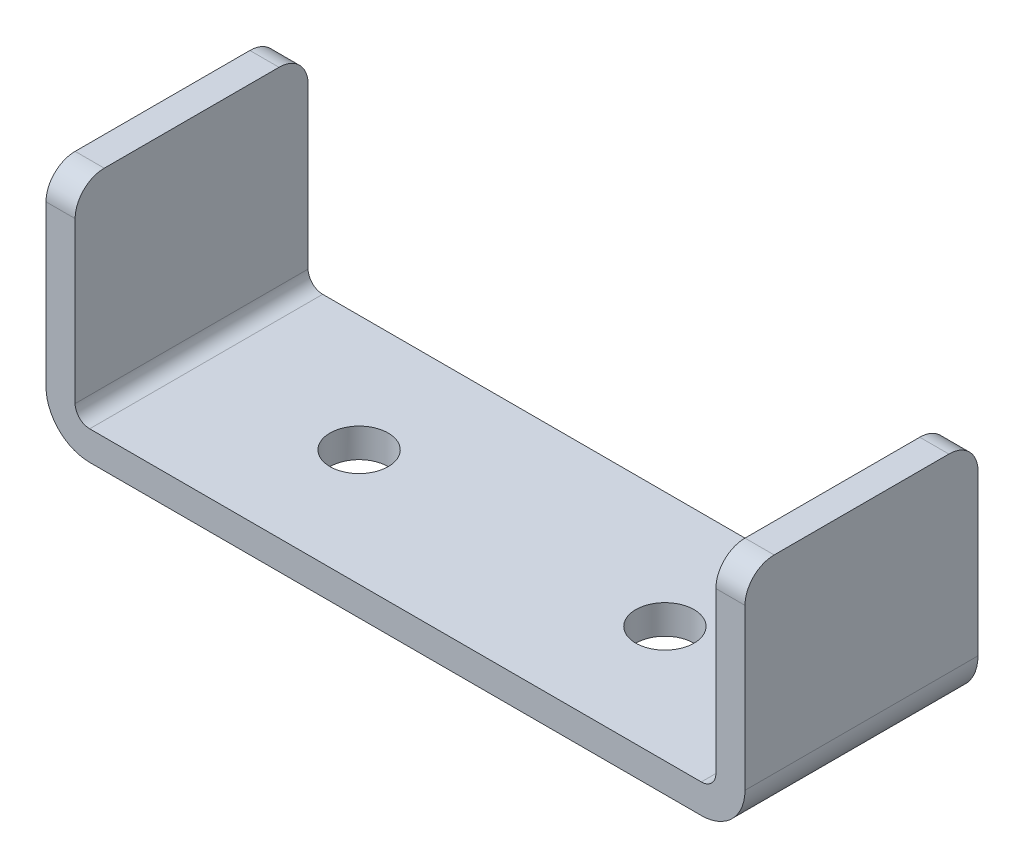
ISO-10303-21;
HEADER;
FILE_DESCRIPTION(('STEP AP214'),'2;1');
FILE_NAME('part.step','',(''),(''),'','','');
FILE_SCHEMA(('AUTOMOTIVE_DESIGN { 1 0 10303 214 1 1 1 1 }'));
ENDSEC;
DATA;
#1=APPLICATION_CONTEXT('core data for automotive mechanical design processes');
#2=APPLICATION_PROTOCOL_DEFINITION('international standard','automotive_design',2000,#1);
#3=PRODUCT_CONTEXT('',#1,'mechanical');
#4=PRODUCT('Part','Part','',(#3));
#5=PRODUCT_RELATED_PRODUCT_CATEGORY('part','',(#4));
#6=PRODUCT_DEFINITION_FORMATION('','',#4);
#7=PRODUCT_DEFINITION_CONTEXT('part definition',#1,'design');
#8=PRODUCT_DEFINITION('design','',#6,#7);
#9=PRODUCT_DEFINITION_SHAPE('','',#8);
#10=(LENGTH_UNIT() NAMED_UNIT(*) SI_UNIT(.MILLI.,.METRE.));
#11=(NAMED_UNIT(*) PLANE_ANGLE_UNIT() SI_UNIT($,.RADIAN.));
#12=(NAMED_UNIT(*) SI_UNIT($,.STERADIAN.) SOLID_ANGLE_UNIT());
#13=UNCERTAINTY_MEASURE_WITH_UNIT(LENGTH_MEASURE(1.E-05),#10,'distance_accuracy_value','');
#14=(GEOMETRIC_REPRESENTATION_CONTEXT(3) GLOBAL_UNCERTAINTY_ASSIGNED_CONTEXT((#13)) GLOBAL_UNIT_ASSIGNED_CONTEXT((#10,
#11,#12)) REPRESENTATION_CONTEXT('',''));
#15=CARTESIAN_POINT('',(0.,0.,0.));
#16=DIRECTION('',(0.,0.,1.));
#17=DIRECTION('',(1.,0.,0.));
#18=AXIS2_PLACEMENT_3D('',#15,#16,#17);
#19=CARTESIAN_POINT('',(76.2,4.7625,-25.4));
#20=DIRECTION('',(1.,0.,0.));
#21=DIRECTION('',(0.,1.,0.));
#22=AXIS2_PLACEMENT_3D('',#19,#20,#21);
#23=PLANE('',#22);
#24=DIRECTION('',(0.,0.,1.));
#25=VECTOR('',#24,1.);
#26=CARTESIAN_POINT('',(76.2,25.4,-25.4));
#27=LINE('',#26,#25);
#28=CARTESIAN_POINT('',(76.2,25.4,-22.225));
#29=VERTEX_POINT('',#28);
#30=CARTESIAN_POINT('',(76.2,25.4,-3.175));
#31=VERTEX_POINT('',#30);
#32=EDGE_CURVE('E195',#29,#31,#27,.T.);
#33=ORIENTED_EDGE('',*,*,#32,.T.);
#34=CARTESIAN_POINT('',(76.2,22.225,-3.175));
#35=DIRECTION('',(1.,0.,0.));
#36=DIRECTION('',(0.,1.,0.));
#37=AXIS2_PLACEMENT_3D('',#34,#35,#36);
#38=CIRCLE('',#37,3.175);
#39=CARTESIAN_POINT('',(76.2,22.225,0.));
#40=VERTEX_POINT('',#39);
#41=EDGE_CURVE('E251',#31,#40,#38,.T.);
#42=ORIENTED_EDGE('',*,*,#41,.T.);
#43=DIRECTION('',(0.,1.,0.));
#44=VECTOR('',#43,1.);
#45=CARTESIAN_POINT('',(76.2,4.7625,0.));
#46=LINE('',#45,#44);
#47=CARTESIAN_POINT('',(76.2,4.7625,0.));
#48=VERTEX_POINT('',#47);
#49=EDGE_CURVE('E196',#48,#40,#46,.T.);
#50=ORIENTED_EDGE('',*,*,#49,.F.);
#51=DIRECTION('',(0.,0.,1.));
#52=VECTOR('',#51,1.);
#53=CARTESIAN_POINT('',(76.2,4.7625,-25.4));
#54=LINE('',#53,#52);
#55=CARTESIAN_POINT('',(76.2,4.7625,-25.4));
#56=VERTEX_POINT('',#55);
#57=EDGE_CURVE('E219',#56,#48,#54,.T.);
#58=ORIENTED_EDGE('',*,*,#57,.F.);
#59=DIRECTION('',(0.,1.,0.));
#60=VECTOR('',#59,1.);
#61=CARTESIAN_POINT('',(76.2,4.7625,-25.4));
#62=LINE('',#61,#60);
#63=CARTESIAN_POINT('',(76.2,22.225,-25.4));
#64=VERTEX_POINT('',#63);
#65=EDGE_CURVE('E172',#56,#64,#62,.T.);
#66=ORIENTED_EDGE('',*,*,#65,.T.);
#67=CARTESIAN_POINT('',(76.2,22.225,-22.225));
#68=DIRECTION('',(1.,0.,0.));
#69=DIRECTION('',(0.,1.,0.));
#70=AXIS2_PLACEMENT_3D('',#67,#68,#69);
#71=CIRCLE('',#70,3.175);
#72=EDGE_CURVE('E249',#64,#29,#71,.T.);
#73=ORIENTED_EDGE('',*,*,#72,.T.);
#74=EDGE_LOOP('',(#33,#42,#50,#58,#66,#73));
#75=FACE_BOUND('',#74,.T.);
#76=ADVANCED_FACE('F31',(#75),#23,.T.);
#77=CARTESIAN_POINT('',(71.4375,4.7625,-25.4));
#78=DIRECTION('',(0.,0.,1.));
#79=DIRECTION('',(1.,0.,0.));
#80=AXIS2_PLACEMENT_3D('',#77,#78,#79);
#81=CYLINDRICAL_SURFACE('',#80,4.76250000000001);
#82=CARTESIAN_POINT('',(71.4375,4.7625,0.));
#83=DIRECTION('',(0.,0.,1.));
#84=DIRECTION('',(1.,0.,0.));
#85=AXIS2_PLACEMENT_3D('',#82,#83,#84);
#86=CIRCLE('',#85,4.76250000000001);
#87=CARTESIAN_POINT('',(71.4375,0.,0.));
#88=VERTEX_POINT('',#87);
#89=EDGE_CURVE('E175',#88,#48,#86,.T.);
#90=ORIENTED_EDGE('',*,*,#89,.F.);
#91=DIRECTION('',(0.,0.,1.));
#92=VECTOR('',#91,1.);
#93=CARTESIAN_POINT('',(71.4375,0.,-25.4));
#94=LINE('',#93,#92);
#95=CARTESIAN_POINT('',(71.4375,0.,-25.4));
#96=VERTEX_POINT('',#95);
#97=EDGE_CURVE('E222',#96,#88,#94,.T.);
#98=ORIENTED_EDGE('',*,*,#97,.F.);
#99=CARTESIAN_POINT('',(71.4375,4.7625,-25.4));
#100=DIRECTION('',(0.,0.,1.));
#101=DIRECTION('',(1.,0.,0.));
#102=AXIS2_PLACEMENT_3D('',#99,#100,#101);
#103=CIRCLE('',#102,4.76250000000001);
#104=EDGE_CURVE('E192',#96,#56,#103,.T.);
#105=ORIENTED_EDGE('',*,*,#104,.T.);
#106=ORIENTED_EDGE('',*,*,#57,.T.);
#107=EDGE_LOOP('',(#90,#98,#105,#106));
#108=FACE_BOUND('',#107,.T.);
#109=ADVANCED_FACE('F308',(#108),#81,.T.);
#110=CARTESIAN_POINT('',(4.7625,0.,-25.4));
#111=DIRECTION('',(0.,-1.,0.));
#112=DIRECTION('',(0.,0.,-1.));
#113=AXIS2_PLACEMENT_3D('',#110,#111,#112);
#114=PLANE('',#113);
#115=CARTESIAN_POINT('',(54.76875,0.,-12.7));
#116=DIRECTION('',(0.,-1.,0.));
#117=DIRECTION('',(0.,0.,-1.));
#118=AXIS2_PLACEMENT_3D('',#115,#116,#117);
#119=CIRCLE('',#118,3.175);
#120=CARTESIAN_POINT('',(54.76875,0.,-15.875));
#121=VERTEX_POINT('',#120);
#122=EDGE_CURVE('E388',#121,#121,#119,.T.);
#123=ORIENTED_EDGE('',*,*,#122,.F.);
#124=EDGE_LOOP('',(#123));
#125=FACE_BOUND('',#124,.T.);
#126=CARTESIAN_POINT('',(21.43125,0.,-12.7));
#127=DIRECTION('',(0.,-1.,0.));
#128=DIRECTION('',(0.,0.,-1.));
#129=AXIS2_PLACEMENT_3D('',#126,#127,#128);
#130=CIRCLE('',#129,3.175);
#131=CARTESIAN_POINT('',(21.43125,0.,-15.875));
#132=VERTEX_POINT('',#131);
#133=EDGE_CURVE('E200',#132,#132,#130,.T.);
#134=ORIENTED_EDGE('',*,*,#133,.F.);
#135=EDGE_LOOP('',(#134));
#136=FACE_BOUND('',#135,.T.);
#137=DIRECTION('',(1.,0.,0.));
#138=VECTOR('',#137,1.);
#139=CARTESIAN_POINT('',(4.7625,0.,0.));
#140=LINE('',#139,#138);
#141=CARTESIAN_POINT('',(4.7625,0.,0.));
#142=VERTEX_POINT('',#141);
#143=EDGE_CURVE('E214',#142,#88,#140,.T.);
#144=ORIENTED_EDGE('',*,*,#143,.F.);
#145=DIRECTION('',(0.,0.,1.));
#146=VECTOR('',#145,1.);
#147=CARTESIAN_POINT('',(4.7625,0.,-25.4));
#148=LINE('',#147,#146);
#149=CARTESIAN_POINT('',(4.7625,0.,-25.4));
#150=VERTEX_POINT('',#149);
#151=EDGE_CURVE('E224',#150,#142,#148,.T.);
#152=ORIENTED_EDGE('',*,*,#151,.F.);
#153=DIRECTION('',(1.,0.,0.));
#154=VECTOR('',#153,1.);
#155=CARTESIAN_POINT('',(4.7625,0.,-25.4));
#156=LINE('',#155,#154);
#157=EDGE_CURVE('E189',#150,#96,#156,.T.);
#158=ORIENTED_EDGE('',*,*,#157,.T.);
#159=ORIENTED_EDGE('',*,*,#97,.T.);
#160=EDGE_LOOP('',(#144,#152,#158,#159));
#161=FACE_BOUND('',#160,.T.);
#162=ADVANCED_FACE('F314',(#125,#136,#161),#114,.T.);
#163=CARTESIAN_POINT('',(4.7625,4.7625,-25.4));
#164=DIRECTION('',(0.,0.,1.));
#165=DIRECTION('',(1.,0.,0.));
#166=AXIS2_PLACEMENT_3D('',#163,#164,#165);
#167=CYLINDRICAL_SURFACE('',#166,4.7625);
#168=CARTESIAN_POINT('',(4.7625,4.7625,0.));
#169=DIRECTION('',(0.,0.,1.));
#170=DIRECTION('',(1.,0.,0.));
#171=AXIS2_PLACEMENT_3D('',#168,#169,#170);
#172=CIRCLE('',#171,4.7625);
#173=CARTESIAN_POINT('',(0.,4.7625,0.));
#174=VERTEX_POINT('',#173);
#175=EDGE_CURVE('E211',#174,#142,#172,.T.);
#176=ORIENTED_EDGE('',*,*,#175,.F.);
#177=DIRECTION('',(0.,0.,1.));
#178=VECTOR('',#177,1.);
#179=CARTESIAN_POINT('',(0.,4.7625,-25.4));
#180=LINE('',#179,#178);
#181=CARTESIAN_POINT('',(0.,4.7625,-25.4));
#182=VERTEX_POINT('',#181);
#183=EDGE_CURVE('E226',#182,#174,#180,.T.);
#184=ORIENTED_EDGE('',*,*,#183,.F.);
#185=CARTESIAN_POINT('',(4.7625,4.7625,-25.4));
#186=DIRECTION('',(0.,0.,1.));
#187=DIRECTION('',(1.,0.,0.));
#188=AXIS2_PLACEMENT_3D('',#185,#186,#187);
#189=CIRCLE('',#188,4.7625);
#190=EDGE_CURVE('E186',#182,#150,#189,.T.);
#191=ORIENTED_EDGE('',*,*,#190,.T.);
#192=ORIENTED_EDGE('',*,*,#151,.T.);
#193=EDGE_LOOP('',(#176,#184,#191,#192));
#194=FACE_BOUND('',#193,.T.);
#195=ADVANCED_FACE('F291',(#194),#167,.T.);
#196=CARTESIAN_POINT('',(0.,25.4,-25.4));
#197=DIRECTION('',(-1.,0.,0.));
#198=DIRECTION('',(0.,-1.,0.));
#199=AXIS2_PLACEMENT_3D('',#196,#197,#198);
#200=PLANE('',#199);
#201=DIRECTION('',(0.,0.,1.));
#202=VECTOR('',#201,1.);
#203=CARTESIAN_POINT('',(0.,25.4,-25.4));
#204=LINE('',#203,#202);
#205=CARTESIAN_POINT('',(0.,25.4,-22.225));
#206=VERTEX_POINT('',#205);
#207=CARTESIAN_POINT('',(0.,25.4,-3.175));
#208=VERTEX_POINT('',#207);
#209=EDGE_CURVE('E229',#206,#208,#204,.T.);
#210=ORIENTED_EDGE('',*,*,#209,.F.);
#211=CARTESIAN_POINT('',(0.,22.225,-22.225));
#212=DIRECTION('',(-1.,0.,0.));
#213=DIRECTION('',(0.,-1.,0.));
#214=AXIS2_PLACEMENT_3D('',#211,#212,#213);
#215=CIRCLE('',#214,3.175);
#216=CARTESIAN_POINT('',(0.,22.225,-25.4));
#217=VERTEX_POINT('',#216);
#218=EDGE_CURVE('E11',#206,#217,#215,.T.);
#219=ORIENTED_EDGE('',*,*,#218,.T.);
#220=DIRECTION('',(0.,-1.,0.));
#221=VECTOR('',#220,1.);
#222=CARTESIAN_POINT('',(0.,25.4,-25.4));
#223=LINE('',#222,#221);
#224=EDGE_CURVE('E184',#217,#182,#223,.T.);
#225=ORIENTED_EDGE('',*,*,#224,.T.);
#226=ORIENTED_EDGE('',*,*,#183,.T.);
#227=DIRECTION('',(0.,-1.,0.));
#228=VECTOR('',#227,1.);
#229=CARTESIAN_POINT('',(0.,25.4,0.));
#230=LINE('',#229,#228);
#231=CARTESIAN_POINT('',(0.,22.225,0.));
#232=VERTEX_POINT('',#231);
#233=EDGE_CURVE('E209',#232,#174,#230,.T.);
#234=ORIENTED_EDGE('',*,*,#233,.F.);
#235=CARTESIAN_POINT('',(0.,22.225,-3.175));
#236=DIRECTION('',(-1.,0.,0.));
#237=DIRECTION('',(0.,-1.,0.));
#238=AXIS2_PLACEMENT_3D('',#235,#236,#237);
#239=CIRCLE('',#238,3.175);
#240=EDGE_CURVE('E39',#232,#208,#239,.T.);
#241=ORIENTED_EDGE('',*,*,#240,.T.);
#242=EDGE_LOOP('',(#210,#219,#225,#226,#234,#241));
#243=FACE_BOUND('',#242,.T.);
#244=ADVANCED_FACE('F288',(#243),#200,.T.);
#245=CARTESIAN_POINT('',(0.,25.4,-25.4));
#246=DIRECTION('',(0.,-1.,0.));
#247=DIRECTION('',(0.,0.,-1.));
#248=AXIS2_PLACEMENT_3D('',#245,#246,#247);
#249=PLANE('',#248);
#250=DIRECTION('',(0.,0.,1.));
#251=VECTOR('',#250,1.);
#252=CARTESIAN_POINT('',(3.175,25.4,-25.4));
#253=LINE('',#252,#251);
#254=CARTESIAN_POINT('',(3.175,25.4,-22.225));
#255=VERTEX_POINT('',#254);
#256=CARTESIAN_POINT('',(3.175,25.4,-3.175));
#257=VERTEX_POINT('',#256);
#258=EDGE_CURVE('E231',#255,#257,#253,.T.);
#259=ORIENTED_EDGE('',*,*,#258,.F.);
#260=DIRECTION('',(1.,0.,0.));
#261=VECTOR('',#260,1.);
#262=CARTESIAN_POINT('',(0.,25.4,-22.225));
#263=LINE('',#262,#261);
#264=EDGE_CURVE('E52',#255,#206,#263,.F.);
#265=ORIENTED_EDGE('',*,*,#264,.T.);
#266=ORIENTED_EDGE('',*,*,#209,.T.);
#267=DIRECTION('',(1.,0.,0.));
#268=VECTOR('',#267,1.);
#269=CARTESIAN_POINT('',(3.175,25.4,-3.175));
#270=LINE('',#269,#268);
#271=EDGE_CURVE('E269',#208,#257,#270,.T.);
#272=ORIENTED_EDGE('',*,*,#271,.T.);
#273=EDGE_LOOP('',(#259,#265,#266,#272));
#274=FACE_BOUND('',#273,.T.);
#275=ADVANCED_FACE('F273',(#274),#249,.F.);
#276=CARTESIAN_POINT('',(3.175,25.4,-25.4));
#277=DIRECTION('',(-1.,0.,0.));
#278=DIRECTION('',(0.,-1.,0.));
#279=AXIS2_PLACEMENT_3D('',#276,#277,#278);
#280=PLANE('',#279);
#281=DIRECTION('',(0.,-1.,0.));
#282=VECTOR('',#281,1.);
#283=CARTESIAN_POINT('',(3.175,25.4,-25.4));
#284=LINE('',#283,#282);
#285=CARTESIAN_POINT('',(3.175,22.225,-25.4));
#286=VERTEX_POINT('',#285);
#287=CARTESIAN_POINT('',(3.175,4.7625,-25.4));
#288=VERTEX_POINT('',#287);
#289=EDGE_CURVE('E182',#286,#288,#284,.T.);
#290=ORIENTED_EDGE('',*,*,#289,.F.);
#291=CARTESIAN_POINT('',(3.175,22.225,-22.225));
#292=DIRECTION('',(-1.,0.,0.));
#293=DIRECTION('',(0.,-1.,0.));
#294=AXIS2_PLACEMENT_3D('',#291,#292,#293);
#295=CIRCLE('',#294,3.175);
#296=EDGE_CURVE('E267',#286,#255,#295,.F.);
#297=ORIENTED_EDGE('',*,*,#296,.T.);
#298=ORIENTED_EDGE('',*,*,#258,.T.);
#299=CARTESIAN_POINT('',(3.175,22.225,-3.175));
#300=DIRECTION('',(-1.,0.,0.));
#301=DIRECTION('',(0.,-1.,0.));
#302=AXIS2_PLACEMENT_3D('',#299,#300,#301);
#303=CIRCLE('',#302,3.175);
#304=CARTESIAN_POINT('',(3.175,22.225,0.));
#305=VERTEX_POINT('',#304);
#306=EDGE_CURVE('E265',#257,#305,#303,.F.);
#307=ORIENTED_EDGE('',*,*,#306,.T.);
#308=DIRECTION('',(0.,-1.,0.));
#309=VECTOR('',#308,1.);
#310=CARTESIAN_POINT('',(3.175,25.4,0.));
#311=LINE('',#310,#309);
#312=CARTESIAN_POINT('',(3.175,4.7625,0.));
#313=VERTEX_POINT('',#312);
#314=EDGE_CURVE('E207',#305,#313,#311,.T.);
#315=ORIENTED_EDGE('',*,*,#314,.T.);
#316=DIRECTION('',(0.,0.,1.));
#317=VECTOR('',#316,1.);
#318=CARTESIAN_POINT('',(3.175,4.7625,-25.4));
#319=LINE('',#318,#317);
#320=EDGE_CURVE('E234',#288,#313,#319,.T.);
#321=ORIENTED_EDGE('',*,*,#320,.F.);
#322=EDGE_LOOP('',(#290,#297,#298,#307,#315,#321));
#323=FACE_BOUND('',#322,.T.);
#324=ADVANCED_FACE('F277',(#323),#280,.F.);
#325=CARTESIAN_POINT('',(4.7625,4.7625,-25.4));
#326=DIRECTION('',(0.,0.,1.));
#327=DIRECTION('',(1.,0.,0.));
#328=AXIS2_PLACEMENT_3D('',#325,#326,#327);
#329=CYLINDRICAL_SURFACE('',#328,1.5875);
#330=CARTESIAN_POINT('',(4.7625,4.7625,0.));
#331=DIRECTION('',(0.,0.,1.));
#332=DIRECTION('',(1.,0.,0.));
#333=AXIS2_PLACEMENT_3D('',#330,#331,#332);
#334=CIRCLE('',#333,1.5875);
#335=CARTESIAN_POINT('',(4.7625,3.175,0.));
#336=VERTEX_POINT('',#335);
#337=EDGE_CURVE('E205',#313,#336,#334,.T.);
#338=ORIENTED_EDGE('',*,*,#337,.T.);
#339=DIRECTION('',(0.,0.,1.));
#340=VECTOR('',#339,1.);
#341=CARTESIAN_POINT('',(4.7625,3.175,-25.4));
#342=LINE('',#341,#340);
#343=CARTESIAN_POINT('',(4.7625,3.175,-25.4));
#344=VERTEX_POINT('',#343);
#345=EDGE_CURVE('E237',#344,#336,#342,.T.);
#346=ORIENTED_EDGE('',*,*,#345,.F.);
#347=CARTESIAN_POINT('',(4.7625,4.7625,-25.4));
#348=DIRECTION('',(0.,0.,1.));
#349=DIRECTION('',(1.,0.,0.));
#350=AXIS2_PLACEMENT_3D('',#347,#348,#349);
#351=CIRCLE('',#350,1.5875);
#352=EDGE_CURVE('E180',#288,#344,#351,.T.);
#353=ORIENTED_EDGE('',*,*,#352,.F.);
#354=ORIENTED_EDGE('',*,*,#320,.T.);
#355=EDGE_LOOP('',(#338,#346,#353,#354));
#356=FACE_BOUND('',#355,.T.);
#357=ADVANCED_FACE('F352',(#356),#329,.F.);
#358=CARTESIAN_POINT('',(4.7625,3.175,-25.4));
#359=DIRECTION('',(0.,-1.,0.));
#360=DIRECTION('',(0.,0.,-1.));
#361=AXIS2_PLACEMENT_3D('',#358,#359,#360);
#362=PLANE('',#361);
#363=CARTESIAN_POINT('',(54.76875,3.175,-12.7));
#364=DIRECTION('',(0.,1.,0.));
#365=DIRECTION('',(0.,0.,-1.));
#366=AXIS2_PLACEMENT_3D('',#363,#364,#365);
#367=CIRCLE('',#366,3.175);
#368=CARTESIAN_POINT('',(54.76875,3.175,-15.875));
#369=VERTEX_POINT('',#368);
#370=EDGE_CURVE('E391',#369,#369,#367,.T.);
#371=ORIENTED_EDGE('',*,*,#370,.F.);
#372=EDGE_LOOP('',(#371));
#373=FACE_BOUND('',#372,.T.);
#374=CARTESIAN_POINT('',(21.43125,3.175,-12.7));
#375=DIRECTION('',(0.,1.,0.));
#376=DIRECTION('',(0.,0.,1.));
#377=AXIS2_PLACEMENT_3D('',#374,#375,#376);
#378=CIRCLE('',#377,3.175);
#379=CARTESIAN_POINT('',(21.43125,3.175,-9.525));
#380=VERTEX_POINT('',#379);
#381=EDGE_CURVE('E393',#380,#380,#378,.T.);
#382=ORIENTED_EDGE('',*,*,#381,.F.);
#383=EDGE_LOOP('',(#382));
#384=FACE_BOUND('',#383,.T.);
#385=DIRECTION('',(1.,0.,0.));
#386=VECTOR('',#385,1.);
#387=CARTESIAN_POINT('',(4.7625,3.175,0.));
#388=LINE('',#387,#386);
#389=CARTESIAN_POINT('',(71.4375,3.17499999999999,0.));
#390=VERTEX_POINT('',#389);
#391=EDGE_CURVE('E203',#336,#390,#388,.T.);
#392=ORIENTED_EDGE('',*,*,#391,.T.);
#393=DIRECTION('',(0.,0.,1.));
#394=VECTOR('',#393,1.);
#395=CARTESIAN_POINT('',(71.4375,3.17499999999999,-25.4));
#396=LINE('',#395,#394);
#397=CARTESIAN_POINT('',(71.4375,3.17499999999999,-25.4));
#398=VERTEX_POINT('',#397);
#399=EDGE_CURVE('E165',#398,#390,#396,.T.);
#400=ORIENTED_EDGE('',*,*,#399,.F.);
#401=DIRECTION('',(1.,0.,0.));
#402=VECTOR('',#401,1.);
#403=CARTESIAN_POINT('',(4.7625,3.175,-25.4));
#404=LINE('',#403,#402);
#405=EDGE_CURVE('E152',#344,#398,#404,.T.);
#406=ORIENTED_EDGE('',*,*,#405,.F.);
#407=ORIENTED_EDGE('',*,*,#345,.T.);
#408=EDGE_LOOP('',(#392,#400,#406,#407));
#409=FACE_BOUND('',#408,.T.);
#410=ADVANCED_FACE('F355',(#373,#384,#409),#362,.F.);
#411=CARTESIAN_POINT('',(71.4375,4.7625,-25.4));
#412=DIRECTION('',(0.,0.,1.));
#413=DIRECTION('',(1.,0.,0.));
#414=AXIS2_PLACEMENT_3D('',#411,#412,#413);
#415=CYLINDRICAL_SURFACE('',#414,1.58750000000001);
#416=CARTESIAN_POINT('',(71.4375,4.7625,0.));
#417=DIRECTION('',(0.,0.,1.));
#418=DIRECTION('',(1.,0.,0.));
#419=AXIS2_PLACEMENT_3D('',#416,#417,#418);
#420=CIRCLE('',#419,1.58750000000001);
#421=CARTESIAN_POINT('',(73.025,4.7625,0.));
#422=VERTEX_POINT('',#421);
#423=EDGE_CURVE('E161',#390,#422,#420,.T.);
#424=ORIENTED_EDGE('',*,*,#423,.T.);
#425=DIRECTION('',(0.,0.,1.));
#426=VECTOR('',#425,1.);
#427=CARTESIAN_POINT('',(73.025,4.7625,-25.4));
#428=LINE('',#427,#426);
#429=CARTESIAN_POINT('',(73.025,4.7625,-25.4));
#430=VERTEX_POINT('',#429);
#431=EDGE_CURVE('E158',#430,#422,#428,.T.);
#432=ORIENTED_EDGE('',*,*,#431,.F.);
#433=CARTESIAN_POINT('',(71.4375,4.7625,-25.4));
#434=DIRECTION('',(0.,0.,1.));
#435=DIRECTION('',(1.,0.,0.));
#436=AXIS2_PLACEMENT_3D('',#433,#434,#435);
#437=CIRCLE('',#436,1.58750000000001);
#438=EDGE_CURVE('E144',#398,#430,#437,.T.);
#439=ORIENTED_EDGE('',*,*,#438,.F.);
#440=ORIENTED_EDGE('',*,*,#399,.T.);
#441=EDGE_LOOP('',(#424,#432,#439,#440));
#442=FACE_BOUND('',#441,.T.);
#443=ADVANCED_FACE('F159',(#442),#415,.F.);
#444=CARTESIAN_POINT('',(73.025,4.7625,-25.4));
#445=DIRECTION('',(1.,0.,0.));
#446=DIRECTION('',(0.,1.,0.));
#447=AXIS2_PLACEMENT_3D('',#444,#445,#446);
#448=PLANE('',#447);
#449=DIRECTION('',(0.,1.,0.));
#450=VECTOR('',#449,1.);
#451=CARTESIAN_POINT('',(73.025,4.7625,0.));
#452=LINE('',#451,#450);
#453=CARTESIAN_POINT('',(73.025,22.225,0.));
#454=VERTEX_POINT('',#453);
#455=EDGE_CURVE('E199',#422,#454,#452,.T.);
#456=ORIENTED_EDGE('',*,*,#455,.T.);
#457=CARTESIAN_POINT('',(73.025,22.225,-3.175));
#458=DIRECTION('',(1.,0.,0.));
#459=DIRECTION('',(0.,1.,0.));
#460=AXIS2_PLACEMENT_3D('',#457,#458,#459);
#461=CIRCLE('',#460,3.175);
#462=CARTESIAN_POINT('',(73.025,25.4,-3.175));
#463=VERTEX_POINT('',#462);
#464=EDGE_CURVE('E258',#454,#463,#461,.F.);
#465=ORIENTED_EDGE('',*,*,#464,.T.);
#466=DIRECTION('',(0.,0.,1.));
#467=VECTOR('',#466,1.);
#468=CARTESIAN_POINT('',(73.025,25.4,-25.4));
#469=LINE('',#468,#467);
#470=CARTESIAN_POINT('',(73.025,25.4,-22.225));
#471=VERTEX_POINT('',#470);
#472=EDGE_CURVE('E166',#471,#463,#469,.T.);
#473=ORIENTED_EDGE('',*,*,#472,.F.);
#474=CARTESIAN_POINT('',(73.025,22.225,-22.225));
#475=DIRECTION('',(1.,0.,0.));
#476=DIRECTION('',(0.,1.,0.));
#477=AXIS2_PLACEMENT_3D('',#474,#475,#476);
#478=CIRCLE('',#477,3.175);
#479=CARTESIAN_POINT('',(73.025,22.225,-25.4));
#480=VERTEX_POINT('',#479);
#481=EDGE_CURVE('E171',#471,#480,#478,.F.);
#482=ORIENTED_EDGE('',*,*,#481,.T.);
#483=DIRECTION('',(0.,1.,0.));
#484=VECTOR('',#483,1.);
#485=CARTESIAN_POINT('',(73.025,4.7625,-25.4));
#486=LINE('',#485,#484);
#487=EDGE_CURVE('E149',#430,#480,#486,.T.);
#488=ORIENTED_EDGE('',*,*,#487,.F.);
#489=ORIENTED_EDGE('',*,*,#431,.T.);
#490=EDGE_LOOP('',(#456,#465,#473,#482,#488,#489));
#491=FACE_BOUND('',#490,.T.);
#492=ADVANCED_FACE('F168',(#491),#448,.F.);
#493=CARTESIAN_POINT('',(73.025,25.4,-25.4));
#494=DIRECTION('',(0.,-1.,0.));
#495=DIRECTION('',(0.,0.,-1.));
#496=AXIS2_PLACEMENT_3D('',#493,#494,#495);
#497=PLANE('',#496);
#498=ORIENTED_EDGE('',*,*,#472,.T.);
#499=DIRECTION('',(1.,0.,0.));
#500=VECTOR('',#499,1.);
#501=CARTESIAN_POINT('',(76.2,25.4,-3.175));
#502=LINE('',#501,#500);
#503=EDGE_CURVE('E246',#463,#31,#502,.T.);
#504=ORIENTED_EDGE('',*,*,#503,.T.);
#505=ORIENTED_EDGE('',*,*,#32,.F.);
#506=DIRECTION('',(1.,0.,0.));
#507=VECTOR('',#506,1.);
#508=CARTESIAN_POINT('',(73.025,25.4,-22.225));
#509=LINE('',#508,#507);
#510=EDGE_CURVE('E221',#29,#471,#509,.F.);
#511=ORIENTED_EDGE('',*,*,#510,.T.);
#512=EDGE_LOOP('',(#498,#504,#505,#511));
#513=FACE_BOUND('',#512,.T.);
#514=ADVANCED_FACE('F319',(#513),#497,.F.);
#515=CARTESIAN_POINT('',(71.4375,4.7625,-25.4));
#516=DIRECTION('',(0.,0.,1.));
#517=DIRECTION('',(1.,0.,0.));
#518=AXIS2_PLACEMENT_3D('',#515,#516,#517);
#519=PLANE('',#518);
#520=ORIENTED_EDGE('',*,*,#487,.T.);
#521=DIRECTION('',(1.,0.,0.));
#522=VECTOR('',#521,1.);
#523=CARTESIAN_POINT('',(71.4375,22.225,-25.4));
#524=LINE('',#523,#522);
#525=EDGE_CURVE('E263',#480,#64,#524,.T.);
#526=ORIENTED_EDGE('',*,*,#525,.T.);
#527=ORIENTED_EDGE('',*,*,#65,.F.);
#528=ORIENTED_EDGE('',*,*,#104,.F.);
#529=ORIENTED_EDGE('',*,*,#157,.F.);
#530=ORIENTED_EDGE('',*,*,#190,.F.);
#531=ORIENTED_EDGE('',*,*,#224,.F.);
#532=DIRECTION('',(1.,0.,0.));
#533=VECTOR('',#532,1.);
#534=CARTESIAN_POINT('',(71.4375,22.225,-25.4));
#535=LINE('',#534,#533);
#536=EDGE_CURVE('E260',#217,#286,#535,.T.);
#537=ORIENTED_EDGE('',*,*,#536,.T.);
#538=ORIENTED_EDGE('',*,*,#289,.T.);
#539=ORIENTED_EDGE('',*,*,#352,.T.);
#540=ORIENTED_EDGE('',*,*,#405,.T.);
#541=ORIENTED_EDGE('',*,*,#438,.T.);
#542=EDGE_LOOP('',(#520,#526,#527,#528,#529,#530,#531,#537,#538,#539,#540,#541));
#543=FACE_BOUND('',#542,.T.);
#544=ADVANCED_FACE('F146',(#543),#519,.F.);
#545=CARTESIAN_POINT('',(71.4375,4.7625,0.));
#546=DIRECTION('',(0.,0.,1.));
#547=DIRECTION('',(1.,0.,0.));
#548=AXIS2_PLACEMENT_3D('',#545,#546,#547);
#549=PLANE('',#548);
#550=ORIENTED_EDGE('',*,*,#49,.T.);
#551=DIRECTION('',(1.,0.,0.));
#552=VECTOR('',#551,1.);
#553=CARTESIAN_POINT('',(73.025,22.225,0.));
#554=LINE('',#553,#552);
#555=EDGE_CURVE('E255',#40,#454,#554,.F.);
#556=ORIENTED_EDGE('',*,*,#555,.T.);
#557=ORIENTED_EDGE('',*,*,#455,.F.);
#558=ORIENTED_EDGE('',*,*,#423,.F.);
#559=ORIENTED_EDGE('',*,*,#391,.F.);
#560=ORIENTED_EDGE('',*,*,#337,.F.);
#561=ORIENTED_EDGE('',*,*,#314,.F.);
#562=DIRECTION('',(1.,0.,0.));
#563=VECTOR('',#562,1.);
#564=CARTESIAN_POINT('',(0.,22.225,0.));
#565=LINE('',#564,#563);
#566=EDGE_CURVE('E253',#305,#232,#565,.F.);
#567=ORIENTED_EDGE('',*,*,#566,.T.);
#568=ORIENTED_EDGE('',*,*,#233,.T.);
#569=ORIENTED_EDGE('',*,*,#175,.T.);
#570=ORIENTED_EDGE('',*,*,#143,.T.);
#571=ORIENTED_EDGE('',*,*,#89,.T.);
#572=EDGE_LOOP('',(#550,#556,#557,#558,#559,#560,#561,#567,#568,#569,#570,#571));
#573=FACE_BOUND('',#572,.T.);
#574=ADVANCED_FACE('F294',(#573),#549,.T.);
#575=CARTESIAN_POINT('',(73.025,22.225,-3.175));
#576=DIRECTION('',(-1.,0.,0.));
#577=DIRECTION('',(0.,0.,1.));
#578=AXIS2_PLACEMENT_3D('',#575,#576,#577);
#579=CYLINDRICAL_SURFACE('',#578,3.175);
#580=ORIENTED_EDGE('',*,*,#464,.F.);
#581=ORIENTED_EDGE('',*,*,#555,.F.);
#582=ORIENTED_EDGE('',*,*,#41,.F.);
#583=ORIENTED_EDGE('',*,*,#503,.F.);
#584=EDGE_LOOP('',(#580,#581,#582,#583));
#585=FACE_BOUND('',#584,.T.);
#586=ADVANCED_FACE('F321',(#585),#579,.T.);
#587=CARTESIAN_POINT('',(71.4375,22.225,-22.225));
#588=DIRECTION('',(1.,0.,0.));
#589=DIRECTION('',(0.,0.,-1.));
#590=AXIS2_PLACEMENT_3D('',#587,#588,#589);
#591=CYLINDRICAL_SURFACE('',#590,3.175);
#592=ORIENTED_EDGE('',*,*,#481,.F.);
#593=ORIENTED_EDGE('',*,*,#510,.F.);
#594=ORIENTED_EDGE('',*,*,#72,.F.);
#595=ORIENTED_EDGE('',*,*,#525,.F.);
#596=EDGE_LOOP('',(#592,#593,#594,#595));
#597=FACE_BOUND('',#596,.T.);
#598=ADVANCED_FACE('F306',(#597),#591,.T.);
#599=CARTESIAN_POINT('',(71.4375,22.225,-22.225));
#600=DIRECTION('',(1.,0.,0.));
#601=DIRECTION('',(0.,0.,-1.));
#602=AXIS2_PLACEMENT_3D('',#599,#600,#601);
#603=CYLINDRICAL_SURFACE('',#602,3.175);
#604=ORIENTED_EDGE('',*,*,#218,.F.);
#605=ORIENTED_EDGE('',*,*,#264,.F.);
#606=ORIENTED_EDGE('',*,*,#296,.F.);
#607=ORIENTED_EDGE('',*,*,#536,.F.);
#608=EDGE_LOOP('',(#604,#605,#606,#607));
#609=FACE_BOUND('',#608,.T.);
#610=ADVANCED_FACE('F283',(#609),#603,.T.);
#611=CARTESIAN_POINT('',(0.,22.225,-3.175));
#612=DIRECTION('',(-1.,0.,0.));
#613=DIRECTION('',(0.,0.,1.));
#614=AXIS2_PLACEMENT_3D('',#611,#612,#613);
#615=CYLINDRICAL_SURFACE('',#614,3.175);
#616=ORIENTED_EDGE('',*,*,#240,.F.);
#617=ORIENTED_EDGE('',*,*,#566,.F.);
#618=ORIENTED_EDGE('',*,*,#306,.F.);
#619=ORIENTED_EDGE('',*,*,#271,.F.);
#620=EDGE_LOOP('',(#616,#617,#618,#619));
#621=FACE_BOUND('',#620,.T.);
#622=ADVANCED_FACE('F33',(#621),#615,.T.);
#623=CARTESIAN_POINT('',(21.43125,-22.225,-12.7));
#624=DIRECTION('',(0.,1.,0.));
#625=DIRECTION('',(0.,0.,1.));
#626=AXIS2_PLACEMENT_3D('',#623,#624,#625);
#627=CYLINDRICAL_SURFACE('',#626,3.175);
#628=ORIENTED_EDGE('',*,*,#133,.T.);
#629=EDGE_LOOP('',(#628));
#630=FACE_BOUND('',#629,.T.);
#631=ORIENTED_EDGE('',*,*,#381,.T.);
#632=EDGE_LOOP('',(#631));
#633=FACE_BOUND('',#632,.T.);
#634=ADVANCED_FACE('F298',(#630,#633),#627,.F.);
#635=CARTESIAN_POINT('',(54.76875,-22.225,-12.7));
#636=DIRECTION('',(0.,1.,0.));
#637=DIRECTION('',(0.,0.,1.));
#638=AXIS2_PLACEMENT_3D('',#635,#636,#637);
#639=CYLINDRICAL_SURFACE('',#638,3.175);
#640=ORIENTED_EDGE('',*,*,#122,.T.);
#641=EDGE_LOOP('',(#640));
#642=FACE_BOUND('',#641,.T.);
#643=ORIENTED_EDGE('',*,*,#370,.T.);
#644=EDGE_LOOP('',(#643));
#645=FACE_BOUND('',#644,.T.);
#646=ADVANCED_FACE('F303',(#642,#645),#639,.F.);
#647=CLOSED_SHELL('',(#76,#109,#162,#195,#244,#275,#324,#357,#410,#443,#492,#514,#544,#574,#586,
#598,#610,#622,#634,#646));
#648=MANIFOLD_SOLID_BREP('B2',#647);
#649=ADVANCED_BREP_SHAPE_REPRESENTATION('',(#18,#648),#14);
#650=SHAPE_DEFINITION_REPRESENTATION(#9,#649);
ENDSEC;
END-ISO-10303-21;
